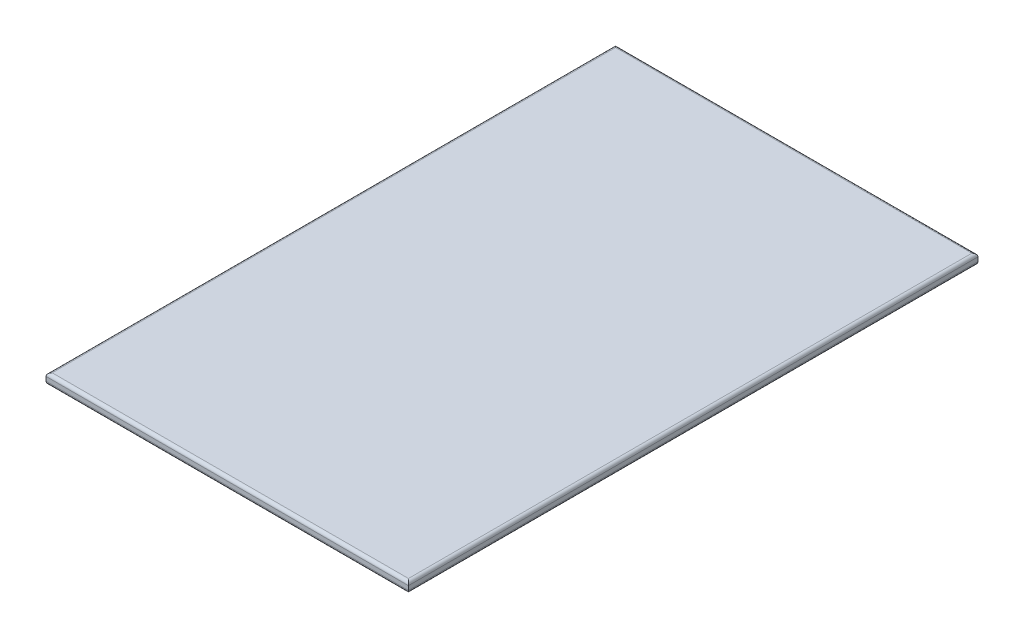
ISO-10303-21;
HEADER;
FILE_DESCRIPTION(('STEP AP214'),'2;1');
FILE_NAME('part.step','',(''),(''),'','','');
FILE_SCHEMA(('AUTOMOTIVE_DESIGN { 1 0 10303 214 1 1 1 1 }'));
ENDSEC;
DATA;
#1=APPLICATION_CONTEXT('core data for automotive mechanical design processes');
#2=APPLICATION_PROTOCOL_DEFINITION('international standard','automotive_design',2000,#1);
#3=PRODUCT_CONTEXT('',#1,'mechanical');
#4=PRODUCT('Part','Part','',(#3));
#5=PRODUCT_RELATED_PRODUCT_CATEGORY('part','',(#4));
#6=PRODUCT_DEFINITION_FORMATION('','',#4);
#7=PRODUCT_DEFINITION_CONTEXT('part definition',#1,'design');
#8=PRODUCT_DEFINITION('design','',#6,#7);
#9=PRODUCT_DEFINITION_SHAPE('','',#8);
#10=(LENGTH_UNIT() NAMED_UNIT(*) SI_UNIT(.MILLI.,.METRE.));
#11=(NAMED_UNIT(*) PLANE_ANGLE_UNIT() SI_UNIT($,.RADIAN.));
#12=(NAMED_UNIT(*) SI_UNIT($,.STERADIAN.) SOLID_ANGLE_UNIT());
#13=UNCERTAINTY_MEASURE_WITH_UNIT(LENGTH_MEASURE(1.E-05),#10,'distance_accuracy_value','');
#14=(GEOMETRIC_REPRESENTATION_CONTEXT(3) GLOBAL_UNCERTAINTY_ASSIGNED_CONTEXT((#13)) GLOBAL_UNIT_ASSIGNED_CONTEXT((#10,
#11,#12)) REPRESENTATION_CONTEXT('',''));
#15=CARTESIAN_POINT('',(0.,0.,0.));
#16=DIRECTION('',(0.,0.,1.));
#17=DIRECTION('',(1.,0.,0.));
#18=AXIS2_PLACEMENT_3D('',#15,#16,#17);
#19=CARTESIAN_POINT('',(17.5,0.999999999999997,-27.5));
#20=DIRECTION('',(-1.,0.,0.));
#21=DIRECTION('',(0.,0.,1.));
#22=AXIS2_PLACEMENT_3D('',#19,#20,#21);
#23=PLANE('',#22);
#24=DIRECTION('',(0.,-1.,0.));
#25=VECTOR('',#24,1.);
#26=CARTESIAN_POINT('',(17.5,0.999999999999997,27.5));
#27=LINE('',#26,#25);
#28=CARTESIAN_POINT('',(17.5,0.699999999999997,27.5));
#29=VERTEX_POINT('',#28);
#30=CARTESIAN_POINT('',(17.5,0.3,27.5));
#31=VERTEX_POINT('',#30);
#32=EDGE_CURVE('E142',#29,#31,#27,.T.);
#33=ORIENTED_EDGE('',*,*,#32,.T.);
#34=DIRECTION('',(0.,0.,-1.));
#35=VECTOR('',#34,1.);
#36=CARTESIAN_POINT('',(17.5,0.3,-27.5));
#37=LINE('',#36,#35);
#38=CARTESIAN_POINT('',(17.5,0.3,-27.5));
#39=VERTEX_POINT('',#38);
#40=EDGE_CURVE('E151',#31,#39,#37,.T.);
#41=ORIENTED_EDGE('',*,*,#40,.T.);
#42=DIRECTION('',(0.,-1.,0.));
#43=VECTOR('',#42,1.);
#44=CARTESIAN_POINT('',(17.5,0.999999999999997,-27.5));
#45=LINE('',#44,#43);
#46=CARTESIAN_POINT('',(17.5,0.699999999999997,-27.5));
#47=VERTEX_POINT('',#46);
#48=EDGE_CURVE('E120',#47,#39,#45,.T.);
#49=ORIENTED_EDGE('',*,*,#48,.F.);
#50=DIRECTION('',(0.,0.,-1.));
#51=VECTOR('',#50,1.);
#52=CARTESIAN_POINT('',(17.5,0.699999999999997,27.5));
#53=LINE('',#52,#51);
#54=EDGE_CURVE('E153',#47,#29,#53,.F.);
#55=ORIENTED_EDGE('',*,*,#54,.T.);
#56=EDGE_LOOP('',(#33,#41,#49,#55));
#57=FACE_BOUND('',#56,.T.);
#58=ADVANCED_FACE('F33',(#57),#23,.F.);
#59=CARTESIAN_POINT('',(-17.5,0.999999999999997,-27.5));
#60=DIRECTION('',(0.,0.,1.));
#61=DIRECTION('',(1.,0.,0.));
#62=AXIS2_PLACEMENT_3D('',#59,#60,#61);
#63=PLANE('',#62);
#64=ORIENTED_EDGE('',*,*,#48,.T.);
#65=DIRECTION('',(-1.,0.,0.));
#66=VECTOR('',#65,1.);
#67=CARTESIAN_POINT('',(-17.5,0.3,-27.5));
#68=LINE('',#67,#66);
#69=CARTESIAN_POINT('',(-17.5,0.3,-27.5));
#70=VERTEX_POINT('',#69);
#71=EDGE_CURVE('E119',#39,#70,#68,.T.);
#72=ORIENTED_EDGE('',*,*,#71,.T.);
#73=DIRECTION('',(0.,-1.,0.));
#74=VECTOR('',#73,1.);
#75=CARTESIAN_POINT('',(-17.5,0.999999999999997,-27.5));
#76=LINE('',#75,#74);
#77=CARTESIAN_POINT('',(-17.5,0.699999999999997,-27.5));
#78=VERTEX_POINT('',#77);
#79=EDGE_CURVE('E102',#78,#70,#76,.T.);
#80=ORIENTED_EDGE('',*,*,#79,.F.);
#81=DIRECTION('',(-1.,0.,0.));
#82=VECTOR('',#81,1.);
#83=CARTESIAN_POINT('',(17.5,0.699999999999997,-27.5));
#84=LINE('',#83,#82);
#85=EDGE_CURVE('E116',#78,#47,#84,.F.);
#86=ORIENTED_EDGE('',*,*,#85,.T.);
#87=EDGE_LOOP('',(#64,#72,#80,#86));
#88=FACE_BOUND('',#87,.T.);
#89=ADVANCED_FACE('F115',(#88),#63,.F.);
#90=CARTESIAN_POINT('',(-17.5,0.999999999999997,-27.5));
#91=DIRECTION('',(1.,0.,0.));
#92=DIRECTION('',(0.,0.,-1.));
#93=AXIS2_PLACEMENT_3D('',#90,#91,#92);
#94=PLANE('',#93);
#95=ORIENTED_EDGE('',*,*,#79,.T.);
#96=DIRECTION('',(0.,0.,1.));
#97=VECTOR('',#96,1.);
#98=CARTESIAN_POINT('',(-17.5,0.3,-27.5));
#99=LINE('',#98,#97);
#100=CARTESIAN_POINT('',(-17.5,0.3,27.5));
#101=VERTEX_POINT('',#100);
#102=EDGE_CURVE('E108',#70,#101,#99,.T.);
#103=ORIENTED_EDGE('',*,*,#102,.T.);
#104=DIRECTION('',(0.,-1.,0.));
#105=VECTOR('',#104,1.);
#106=CARTESIAN_POINT('',(-17.5,0.999999999999997,27.5));
#107=LINE('',#106,#105);
#108=CARTESIAN_POINT('',(-17.5,0.699999999999997,27.5));
#109=VERTEX_POINT('',#108);
#110=EDGE_CURVE('E104',#109,#101,#107,.T.);
#111=ORIENTED_EDGE('',*,*,#110,.F.);
#112=DIRECTION('',(0.,0.,1.));
#113=VECTOR('',#112,1.);
#114=CARTESIAN_POINT('',(-17.5,0.699999999999997,-27.5));
#115=LINE('',#114,#113);
#116=EDGE_CURVE('E99',#109,#78,#115,.F.);
#117=ORIENTED_EDGE('',*,*,#116,.T.);
#118=EDGE_LOOP('',(#95,#103,#111,#117));
#119=FACE_BOUND('',#118,.T.);
#120=ADVANCED_FACE('F101',(#119),#94,.F.);
#121=CARTESIAN_POINT('',(-17.5,0.999999999999997,27.5));
#122=DIRECTION('',(0.,0.,-1.));
#123=DIRECTION('',(-1.,0.,0.));
#124=AXIS2_PLACEMENT_3D('',#121,#122,#123);
#125=PLANE('',#124);
#126=ORIENTED_EDGE('',*,*,#110,.T.);
#127=DIRECTION('',(1.,0.,0.));
#128=VECTOR('',#127,1.);
#129=CARTESIAN_POINT('',(-17.5,0.3,27.5));
#130=LINE('',#129,#128);
#131=EDGE_CURVE('E155',#101,#31,#130,.T.);
#132=ORIENTED_EDGE('',*,*,#131,.T.);
#133=ORIENTED_EDGE('',*,*,#32,.F.);
#134=DIRECTION('',(1.,0.,0.));
#135=VECTOR('',#134,1.);
#136=CARTESIAN_POINT('',(-17.5,0.699999999999997,27.5));
#137=LINE('',#136,#135);
#138=EDGE_CURVE('E157',#29,#109,#137,.F.);
#139=ORIENTED_EDGE('',*,*,#138,.T.);
#140=EDGE_LOOP('',(#126,#132,#133,#139));
#141=FACE_BOUND('',#140,.T.);
#142=ADVANCED_FACE('F195',(#141),#125,.F.);
#143=CARTESIAN_POINT('',(0.,0.999999999999997,0.));
#144=DIRECTION('',(0.,1.,0.));
#145=DIRECTION('',(0.,0.,1.));
#146=AXIS2_PLACEMENT_3D('',#143,#144,#145);
#147=PLANE('',#146);
#148=DIRECTION('',(0.,0.,1.));
#149=VECTOR('',#148,1.);
#150=CARTESIAN_POINT('',(-17.2,0.999999999999997,27.5));
#151=LINE('',#150,#149);
#152=CARTESIAN_POINT('',(-17.2,0.999999999999997,-27.2));
#153=VERTEX_POINT('',#152);
#154=CARTESIAN_POINT('',(-17.2,0.999999999999997,27.2));
#155=VERTEX_POINT('',#154);
#156=EDGE_CURVE('E42',#153,#155,#151,.T.);
#157=ORIENTED_EDGE('',*,*,#156,.T.);
#158=DIRECTION('',(1.,0.,0.));
#159=VECTOR('',#158,1.);
#160=CARTESIAN_POINT('',(17.5,0.999999999999997,27.2));
#161=LINE('',#160,#159);
#162=CARTESIAN_POINT('',(17.2,0.999999999999997,27.2));
#163=VERTEX_POINT('',#162);
#164=EDGE_CURVE('E11',#155,#163,#161,.T.);
#165=ORIENTED_EDGE('',*,*,#164,.T.);
#166=DIRECTION('',(0.,0.,-1.));
#167=VECTOR('',#166,1.);
#168=CARTESIAN_POINT('',(17.2,0.999999999999997,-27.5));
#169=LINE('',#168,#167);
#170=CARTESIAN_POINT('',(17.2,0.999999999999997,-27.2));
#171=VERTEX_POINT('',#170);
#172=EDGE_CURVE('E149',#163,#171,#169,.T.);
#173=ORIENTED_EDGE('',*,*,#172,.T.);
#174=DIRECTION('',(-1.,0.,0.));
#175=VECTOR('',#174,1.);
#176=CARTESIAN_POINT('',(-17.5,0.999999999999997,-27.2));
#177=LINE('',#176,#175);
#178=EDGE_CURVE('E53',#171,#153,#177,.T.);
#179=ORIENTED_EDGE('',*,*,#178,.T.);
#180=EDGE_LOOP('',(#157,#165,#173,#179));
#181=FACE_BOUND('',#180,.T.);
#182=ADVANCED_FACE('F201',(#181),#147,.T.);
#183=CARTESIAN_POINT('',(0.,0.,0.));
#184=DIRECTION('',(0.,1.,0.));
#185=DIRECTION('',(0.,0.,1.));
#186=AXIS2_PLACEMENT_3D('',#183,#184,#185);
#187=PLANE('',#186);
#188=DIRECTION('',(0.,0.,1.));
#189=VECTOR('',#188,1.);
#190=CARTESIAN_POINT('',(-17.2,0.,0.));
#191=LINE('',#190,#189);
#192=CARTESIAN_POINT('',(-17.2,0.,27.2));
#193=VERTEX_POINT('',#192);
#194=CARTESIAN_POINT('',(-17.2,0.,-27.2));
#195=VERTEX_POINT('',#194);
#196=EDGE_CURVE('E162',#193,#195,#191,.F.);
#197=ORIENTED_EDGE('',*,*,#196,.T.);
#198=DIRECTION('',(-1.,0.,0.));
#199=VECTOR('',#198,1.);
#200=CARTESIAN_POINT('',(0.,0.,-27.2));
#201=LINE('',#200,#199);
#202=CARTESIAN_POINT('',(17.2,0.,-27.2));
#203=VERTEX_POINT('',#202);
#204=EDGE_CURVE('E109',#195,#203,#201,.F.);
#205=ORIENTED_EDGE('',*,*,#204,.T.);
#206=DIRECTION('',(0.,0.,-1.));
#207=VECTOR('',#206,1.);
#208=CARTESIAN_POINT('',(17.2,0.,0.));
#209=LINE('',#208,#207);
#210=CARTESIAN_POINT('',(17.2,0.,27.2));
#211=VERTEX_POINT('',#210);
#212=EDGE_CURVE('E166',#203,#211,#209,.F.);
#213=ORIENTED_EDGE('',*,*,#212,.T.);
#214=DIRECTION('',(1.,0.,0.));
#215=VECTOR('',#214,1.);
#216=CARTESIAN_POINT('',(0.,0.,27.2));
#217=LINE('',#216,#215);
#218=EDGE_CURVE('E164',#211,#193,#217,.F.);
#219=ORIENTED_EDGE('',*,*,#218,.T.);
#220=EDGE_LOOP('',(#197,#205,#213,#219));
#221=FACE_BOUND('',#220,.T.);
#222=ADVANCED_FACE('F203',(#221),#187,.F.);
#223=CARTESIAN_POINT('',(-17.5,0.3,27.2));
#224=DIRECTION('',(1.,0.,0.));
#225=DIRECTION('',(0.,0.,-1.));
#226=AXIS2_PLACEMENT_3D('',#223,#224,#225);
#227=CYLINDRICAL_SURFACE('',#226,0.3);
#228=CARTESIAN_POINT('',(-17.2,0.3,27.2));
#229=DIRECTION('',(0.707106781186548,0.,0.707106781186547));
#230=DIRECTION('',(0.707106781186547,0.,-0.707106781186548));
#231=AXIS2_PLACEMENT_3D('',#228,#229,#230);
#232=ELLIPSE('',#231,0.424264068711928,0.3);
#233=EDGE_CURVE('E143',#193,#101,#232,.F.);
#234=ORIENTED_EDGE('',*,*,#233,.F.);
#235=ORIENTED_EDGE('',*,*,#218,.F.);
#236=CARTESIAN_POINT('',(17.2,0.3,27.2));
#237=DIRECTION('',(0.707106781186547,0.,-0.707106781186548));
#238=DIRECTION('',(-0.707106781186548,0.,-0.707106781186547));
#239=AXIS2_PLACEMENT_3D('',#236,#237,#238);
#240=ELLIPSE('',#239,0.424264068711929,0.3);
#241=EDGE_CURVE('E139',#31,#211,#240,.T.);
#242=ORIENTED_EDGE('',*,*,#241,.F.);
#243=ORIENTED_EDGE('',*,*,#131,.F.);
#244=EDGE_LOOP('',(#234,#235,#242,#243));
#245=FACE_BOUND('',#244,.T.);
#246=ADVANCED_FACE('F182',(#245),#227,.T.);
#247=CARTESIAN_POINT('',(17.2,0.3,-27.5));
#248=DIRECTION('',(0.,0.,-1.));
#249=DIRECTION('',(-1.,0.,0.));
#250=AXIS2_PLACEMENT_3D('',#247,#248,#249);
#251=CYLINDRICAL_SURFACE('',#250,0.3);
#252=ORIENTED_EDGE('',*,*,#241,.T.);
#253=ORIENTED_EDGE('',*,*,#212,.F.);
#254=CARTESIAN_POINT('',(17.2,0.3,-27.2));
#255=DIRECTION('',(-0.707106781186548,0.,-0.707106781186547));
#256=DIRECTION('',(0.707106781186547,0.,-0.707106781186548));
#257=AXIS2_PLACEMENT_3D('',#254,#255,#256);
#258=ELLIPSE('',#257,0.424264068711928,0.3);
#259=EDGE_CURVE('E130',#39,#203,#258,.T.);
#260=ORIENTED_EDGE('',*,*,#259,.F.);
#261=ORIENTED_EDGE('',*,*,#40,.F.);
#262=EDGE_LOOP('',(#252,#253,#260,#261));
#263=FACE_BOUND('',#262,.T.);
#264=ADVANCED_FACE('F186',(#263),#251,.T.);
#265=CARTESIAN_POINT('',(-17.2,0.3,-27.5));
#266=DIRECTION('',(0.,0.,1.));
#267=DIRECTION('',(1.,0.,0.));
#268=AXIS2_PLACEMENT_3D('',#265,#266,#267);
#269=CYLINDRICAL_SURFACE('',#268,0.3);
#270=ORIENTED_EDGE('',*,*,#233,.T.);
#271=ORIENTED_EDGE('',*,*,#102,.F.);
#272=CARTESIAN_POINT('',(-17.2,0.3,-27.2));
#273=DIRECTION('',(-0.707106781186547,0.,0.707106781186548));
#274=DIRECTION('',(0.707106781186548,0.,0.707106781186547));
#275=AXIS2_PLACEMENT_3D('',#272,#273,#274);
#276=ELLIPSE('',#275,0.424264068711929,0.3);
#277=EDGE_CURVE('E129',#195,#70,#276,.F.);
#278=ORIENTED_EDGE('',*,*,#277,.F.);
#279=ORIENTED_EDGE('',*,*,#196,.F.);
#280=EDGE_LOOP('',(#270,#271,#278,#279));
#281=FACE_BOUND('',#280,.T.);
#282=ADVANCED_FACE('F194',(#281),#269,.T.);
#283=CARTESIAN_POINT('',(-17.5,0.3,-27.2));
#284=DIRECTION('',(-1.,0.,0.));
#285=DIRECTION('',(0.,0.,1.));
#286=AXIS2_PLACEMENT_3D('',#283,#284,#285);
#287=CYLINDRICAL_SURFACE('',#286,0.3);
#288=ORIENTED_EDGE('',*,*,#259,.T.);
#289=ORIENTED_EDGE('',*,*,#204,.F.);
#290=ORIENTED_EDGE('',*,*,#277,.T.);
#291=ORIENTED_EDGE('',*,*,#71,.F.);
#292=EDGE_LOOP('',(#288,#289,#290,#291));
#293=FACE_BOUND('',#292,.T.);
#294=ADVANCED_FACE('F189',(#293),#287,.T.);
#295=CARTESIAN_POINT('',(0.,0.699999999999997,-27.2));
#296=DIRECTION('',(1.,0.,0.));
#297=DIRECTION('',(0.,0.,-1.));
#298=AXIS2_PLACEMENT_3D('',#295,#296,#297);
#299=CYLINDRICAL_SURFACE('',#298,0.3);
#300=CARTESIAN_POINT('',(17.2,0.699999999999997,-27.2));
#301=DIRECTION('',(0.707106781186548,0.,0.707106781186547));
#302=DIRECTION('',(-0.707106781186547,0.,0.707106781186548));
#303=AXIS2_PLACEMENT_3D('',#300,#301,#302);
#304=ELLIPSE('',#303,0.424264068711928,0.3);
#305=EDGE_CURVE('E125',#47,#171,#304,.T.);
#306=ORIENTED_EDGE('',*,*,#305,.F.);
#307=ORIENTED_EDGE('',*,*,#85,.F.);
#308=CARTESIAN_POINT('',(-17.2,0.699999999999997,-27.2));
#309=DIRECTION('',(0.707106781186547,0.,-0.707106781186548));
#310=DIRECTION('',(0.707106781186548,0.,0.707106781186547));
#311=AXIS2_PLACEMENT_3D('',#308,#309,#310);
#312=ELLIPSE('',#311,0.424264068711929,0.3);
#313=EDGE_CURVE('E37',#153,#78,#312,.F.);
#314=ORIENTED_EDGE('',*,*,#313,.F.);
#315=ORIENTED_EDGE('',*,*,#178,.F.);
#316=EDGE_LOOP('',(#306,#307,#314,#315));
#317=FACE_BOUND('',#316,.T.);
#318=ADVANCED_FACE('F35',(#317),#299,.T.);
#319=CARTESIAN_POINT('',(-17.2,0.699999999999997,0.));
#320=DIRECTION('',(0.,0.,-1.));
#321=DIRECTION('',(-1.,0.,0.));
#322=AXIS2_PLACEMENT_3D('',#319,#320,#321);
#323=CYLINDRICAL_SURFACE('',#322,0.3);
#324=ORIENTED_EDGE('',*,*,#313,.T.);
#325=ORIENTED_EDGE('',*,*,#116,.F.);
#326=CARTESIAN_POINT('',(-17.2,0.699999999999997,27.2));
#327=DIRECTION('',(-0.707106781186548,0.,-0.707106781186547));
#328=DIRECTION('',(0.707106781186547,0.,-0.707106781186548));
#329=AXIS2_PLACEMENT_3D('',#326,#327,#328);
#330=ELLIPSE('',#329,0.424264068711928,0.3);
#331=EDGE_CURVE('E132',#155,#109,#330,.F.);
#332=ORIENTED_EDGE('',*,*,#331,.F.);
#333=ORIENTED_EDGE('',*,*,#156,.F.);
#334=EDGE_LOOP('',(#324,#325,#332,#333));
#335=FACE_BOUND('',#334,.T.);
#336=ADVANCED_FACE('F128',(#335),#323,.T.);
#337=CARTESIAN_POINT('',(17.2,0.699999999999997,0.));
#338=DIRECTION('',(0.,0.,1.));
#339=DIRECTION('',(1.,0.,0.));
#340=AXIS2_PLACEMENT_3D('',#337,#338,#339);
#341=CYLINDRICAL_SURFACE('',#340,0.3);
#342=ORIENTED_EDGE('',*,*,#305,.T.);
#343=ORIENTED_EDGE('',*,*,#172,.F.);
#344=CARTESIAN_POINT('',(17.2,0.699999999999997,27.2));
#345=DIRECTION('',(-0.707106781186547,0.,0.707106781186548));
#346=DIRECTION('',(0.707106781186548,0.,0.707106781186547));
#347=AXIS2_PLACEMENT_3D('',#344,#345,#346);
#348=ELLIPSE('',#347,0.424264068711929,0.3);
#349=EDGE_CURVE('E135',#29,#163,#348,.T.);
#350=ORIENTED_EDGE('',*,*,#349,.F.);
#351=ORIENTED_EDGE('',*,*,#54,.F.);
#352=EDGE_LOOP('',(#342,#343,#350,#351));
#353=FACE_BOUND('',#352,.T.);
#354=ADVANCED_FACE('F200',(#353),#341,.T.);
#355=CARTESIAN_POINT('',(0.,0.699999999999997,27.2));
#356=DIRECTION('',(-1.,0.,0.));
#357=DIRECTION('',(0.,0.,1.));
#358=AXIS2_PLACEMENT_3D('',#355,#356,#357);
#359=CYLINDRICAL_SURFACE('',#358,0.3);
#360=ORIENTED_EDGE('',*,*,#331,.T.);
#361=ORIENTED_EDGE('',*,*,#138,.F.);
#362=ORIENTED_EDGE('',*,*,#349,.T.);
#363=ORIENTED_EDGE('',*,*,#164,.F.);
#364=EDGE_LOOP('',(#360,#361,#362,#363));
#365=FACE_BOUND('',#364,.T.);
#366=ADVANCED_FACE('F198',(#365),#359,.T.);
#367=CLOSED_SHELL('',(#58,#89,#120,#142,#182,#222,#246,#264,#282,#294,#318,#336,#354,#366));
#368=MANIFOLD_SOLID_BREP('B2',#367);
#369=ADVANCED_BREP_SHAPE_REPRESENTATION('',(#18,#368),#14);
#370=SHAPE_DEFINITION_REPRESENTATION(#9,#369);
ENDSEC;
END-ISO-10303-21;
